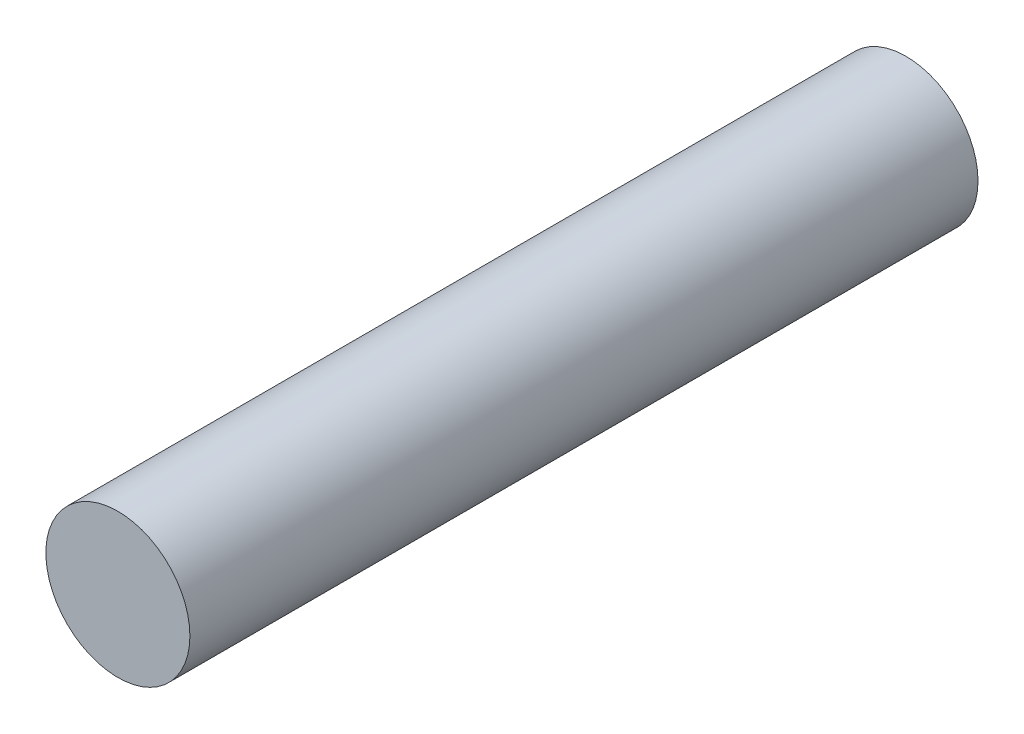
ISO-10303-21;
HEADER;
FILE_DESCRIPTION(('STEP AP214'),'2;1');
FILE_NAME('part.step','',(''),(''),'','','');
FILE_SCHEMA(('AUTOMOTIVE_DESIGN { 1 0 10303 214 1 1 1 1 }'));
ENDSEC;
DATA;
#1=APPLICATION_CONTEXT('core data for automotive mechanical design processes');
#2=APPLICATION_PROTOCOL_DEFINITION('international standard','automotive_design',2000,#1);
#3=PRODUCT_CONTEXT('',#1,'mechanical');
#4=PRODUCT('Part','Part','',(#3));
#5=PRODUCT_RELATED_PRODUCT_CATEGORY('part','',(#4));
#6=PRODUCT_DEFINITION_FORMATION('','',#4);
#7=PRODUCT_DEFINITION_CONTEXT('part definition',#1,'design');
#8=PRODUCT_DEFINITION('design','',#6,#7);
#9=PRODUCT_DEFINITION_SHAPE('','',#8);
#10=(LENGTH_UNIT() NAMED_UNIT(*) SI_UNIT(.MILLI.,.METRE.));
#11=(NAMED_UNIT(*) PLANE_ANGLE_UNIT() SI_UNIT($,.RADIAN.));
#12=(NAMED_UNIT(*) SI_UNIT($,.STERADIAN.) SOLID_ANGLE_UNIT());
#13=UNCERTAINTY_MEASURE_WITH_UNIT(LENGTH_MEASURE(1.E-05),#10,'distance_accuracy_value','');
#14=(GEOMETRIC_REPRESENTATION_CONTEXT(3) GLOBAL_UNCERTAINTY_ASSIGNED_CONTEXT((#13)) GLOBAL_UNIT_ASSIGNED_CONTEXT((#10,
#11,#12)) REPRESENTATION_CONTEXT('',''));
#15=CARTESIAN_POINT('',(0.,0.,0.));
#16=DIRECTION('',(0.,0.,1.));
#17=DIRECTION('',(1.,0.,0.));
#18=AXIS2_PLACEMENT_3D('',#15,#16,#17);
#19=CARTESIAN_POINT('',(0.,0.,45.72));
#20=DIRECTION('',(0.,0.,-1.));
#21=DIRECTION('',(-1.,0.,0.));
#22=AXIS2_PLACEMENT_3D('',#19,#20,#21);
#23=CYLINDRICAL_SURFACE('',#22,4.1783);
#24=CARTESIAN_POINT('',(0.,0.,45.72));
#25=DIRECTION('',(0.,0.,1.));
#26=DIRECTION('',(1.,0.,0.));
#27=AXIS2_PLACEMENT_3D('',#24,#25,#26);
#28=CIRCLE('',#27,4.1783);
#29=CARTESIAN_POINT('',(4.1783,0.,45.72));
#30=VERTEX_POINT('',#29);
#31=EDGE_CURVE('E11',#30,#30,#28,.T.);
#32=ORIENTED_EDGE('',*,*,#31,.F.);
#33=EDGE_LOOP('',(#32));
#34=FACE_BOUND('',#33,.T.);
#35=CARTESIAN_POINT('',(0.,0.,0.));
#36=DIRECTION('',(0.,0.,1.));
#37=DIRECTION('',(1.,0.,0.));
#38=AXIS2_PLACEMENT_3D('',#35,#36,#37);
#39=CIRCLE('',#38,4.1783);
#40=CARTESIAN_POINT('',(4.1783,0.,0.));
#41=VERTEX_POINT('',#40);
#42=EDGE_CURVE('E284',#41,#41,#39,.T.);
#43=ORIENTED_EDGE('',*,*,#42,.T.);
#44=EDGE_LOOP('',(#43));
#45=FACE_BOUND('',#44,.T.);
#46=ADVANCED_FACE('F279',(#34,#45),#23,.T.);
#47=CARTESIAN_POINT('',(0.,0.,45.72));
#48=DIRECTION('',(0.,0.,1.));
#49=DIRECTION('',(1.,0.,0.));
#50=AXIS2_PLACEMENT_3D('',#47,#48,#49);
#51=PLANE('',#50);
#52=ORIENTED_EDGE('',*,*,#31,.T.);
#53=EDGE_LOOP('',(#52));
#54=FACE_BOUND('',#53,.T.);
#55=ADVANCED_FACE('F293',(#54),#51,.T.);
#56=CARTESIAN_POINT('',(0.,0.,0.));
#57=DIRECTION('',(0.,0.,1.));
#58=DIRECTION('',(1.,0.,0.));
#59=AXIS2_PLACEMENT_3D('',#56,#57,#58);
#60=PLANE('',#59);
#61=ORIENTED_EDGE('',*,*,#42,.F.);
#62=EDGE_LOOP('',(#61));
#63=FACE_BOUND('',#62,.T.);
#64=ADVANCED_FACE('F291',(#63),#60,.F.);
#65=CLOSED_SHELL('',(#46,#55,#64));
#66=MANIFOLD_SOLID_BREP('B2',#65);
#67=ADVANCED_BREP_SHAPE_REPRESENTATION('',(#18,#66),#14);
#68=SHAPE_DEFINITION_REPRESENTATION(#9,#67);
ENDSEC;
END-ISO-10303-21;
